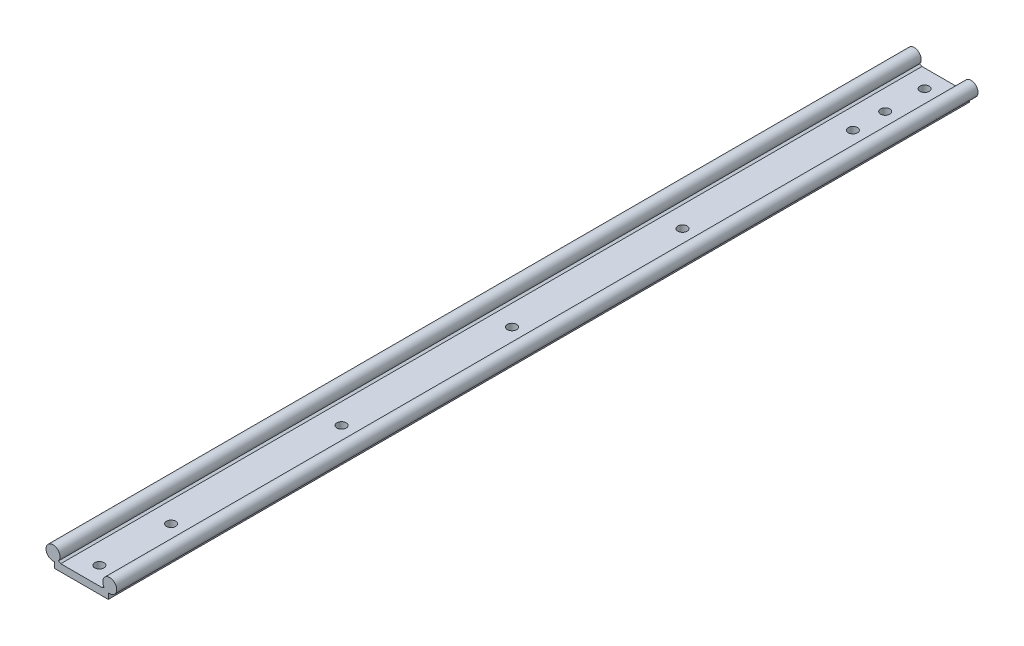
ISO-10303-21;
HEADER;
FILE_DESCRIPTION(('STEP AP214'),'2;1');
FILE_NAME('part.step','',(''),(''),'','','');
FILE_SCHEMA(('AUTOMOTIVE_DESIGN { 1 0 10303 214 1 1 1 1 }'));
ENDSEC;
DATA;
#1=APPLICATION_CONTEXT('core data for automotive mechanical design processes');
#2=APPLICATION_PROTOCOL_DEFINITION('international standard','automotive_design',2000,#1);
#3=PRODUCT_CONTEXT('',#1,'mechanical');
#4=PRODUCT('Part','Part','',(#3));
#5=PRODUCT_RELATED_PRODUCT_CATEGORY('part','',(#4));
#6=PRODUCT_DEFINITION_FORMATION('','',#4);
#7=PRODUCT_DEFINITION_CONTEXT('part definition',#1,'design');
#8=PRODUCT_DEFINITION('design','',#6,#7);
#9=PRODUCT_DEFINITION_SHAPE('','',#8);
#10=(LENGTH_UNIT() NAMED_UNIT(*) SI_UNIT(.MILLI.,.METRE.));
#11=(NAMED_UNIT(*) PLANE_ANGLE_UNIT() SI_UNIT($,.RADIAN.));
#12=(NAMED_UNIT(*) SI_UNIT($,.STERADIAN.) SOLID_ANGLE_UNIT());
#13=UNCERTAINTY_MEASURE_WITH_UNIT(LENGTH_MEASURE(1.E-05),#10,'distance_accuracy_value','');
#14=(GEOMETRIC_REPRESENTATION_CONTEXT(3) GLOBAL_UNCERTAINTY_ASSIGNED_CONTEXT((#13)) GLOBAL_UNIT_ASSIGNED_CONTEXT((#10,
#11,#12)) REPRESENTATION_CONTEXT('',''));
#15=CARTESIAN_POINT('',(0.,0.,0.));
#16=DIRECTION('',(0.,0.,1.));
#17=DIRECTION('',(1.,0.,0.));
#18=AXIS2_PLACEMENT_3D('',#15,#16,#17);
#19=CARTESIAN_POINT('',(20.0914,9.017,304.8));
#20=DIRECTION('',(0.,0.,-1.));
#21=DIRECTION('',(-1.,0.,0.));
#22=AXIS2_PLACEMENT_3D('',#19,#20,#21);
#23=CYLINDRICAL_SURFACE('',#22,4.953);
#24=CARTESIAN_POINT('',(20.0914,9.017,-304.8));
#25=DIRECTION('',(0.,0.,1.));
#26=DIRECTION('',(1.,0.,0.));
#27=AXIS2_PLACEMENT_3D('',#24,#25,#26);
#28=CIRCLE('',#27,4.953);
#29=CARTESIAN_POINT('',(19.05,4.17471799251633,-304.8));
#30=VERTEX_POINT('',#29);
#31=CARTESIAN_POINT('',(16.1741418537718,5.98594447167185,-304.8));
#32=VERTEX_POINT('',#31);
#33=EDGE_CURVE('E131',#30,#32,#28,.T.);
#34=ORIENTED_EDGE('',*,*,#33,.T.);
#35=DIRECTION('',(0.,0.,-1.));
#36=VECTOR('',#35,1.);
#37=CARTESIAN_POINT('',(16.1741418537718,5.98594447167185,304.8));
#38=LINE('',#37,#36);
#39=CARTESIAN_POINT('',(16.1741418537718,5.98594447167185,304.8));
#40=VERTEX_POINT('',#39);
#41=EDGE_CURVE('E11',#40,#32,#38,.T.);
#42=ORIENTED_EDGE('',*,*,#41,.F.);
#43=CARTESIAN_POINT('',(20.0914,9.017,304.8));
#44=DIRECTION('',(0.,0.,1.));
#45=DIRECTION('',(1.,0.,0.));
#46=AXIS2_PLACEMENT_3D('',#43,#44,#45);
#47=CIRCLE('',#46,4.953);
#48=CARTESIAN_POINT('',(19.05,4.17471799251633,304.8));
#49=VERTEX_POINT('',#48);
#50=EDGE_CURVE('E146',#49,#40,#47,.T.);
#51=ORIENTED_EDGE('',*,*,#50,.F.);
#52=DIRECTION('',(0.,0.,-1.));
#53=VECTOR('',#52,1.);
#54=CARTESIAN_POINT('',(19.05,4.17471799251633,304.8));
#55=LINE('',#54,#53);
#56=EDGE_CURVE('E127',#49,#30,#55,.T.);
#57=ORIENTED_EDGE('',*,*,#56,.T.);
#58=EDGE_LOOP('',(#34,#42,#51,#57));
#59=FACE_BOUND('',#58,.T.);
#60=ADVANCED_FACE('F33',(#59),#23,.T.);
#61=CARTESIAN_POINT('',(14.605,5.08,304.8));
#62=DIRECTION('',(0.500000000000001,-0.866025403784438,0.));
#63=DIRECTION('',(0.866025403784438,0.500000000000001,0.));
#64=AXIS2_PLACEMENT_3D('',#61,#62,#63);
#65=PLANE('',#64);
#66=DIRECTION('',(-0.866025403784438,-0.500000000000001,0.));
#67=VECTOR('',#66,1.);
#68=CARTESIAN_POINT('',(14.605,5.08,-304.8));
#69=LINE('',#68,#67);
#70=CARTESIAN_POINT('',(14.605,5.08,-304.8));
#71=VERTEX_POINT('',#70);
#72=EDGE_CURVE('E134',#32,#71,#69,.T.);
#73=ORIENTED_EDGE('',*,*,#72,.T.);
#74=DIRECTION('',(0.,0.,-1.));
#75=VECTOR('',#74,1.);
#76=CARTESIAN_POINT('',(14.605,5.08,304.8));
#77=LINE('',#76,#75);
#78=CARTESIAN_POINT('',(14.605,5.08,304.8));
#79=VERTEX_POINT('',#78);
#80=EDGE_CURVE('E42',#79,#71,#77,.T.);
#81=ORIENTED_EDGE('',*,*,#80,.F.);
#82=DIRECTION('',(-0.866025403784438,-0.500000000000001,0.));
#83=VECTOR('',#82,1.);
#84=CARTESIAN_POINT('',(14.605,5.08,304.8));
#85=LINE('',#84,#83);
#86=EDGE_CURVE('E94',#40,#79,#85,.T.);
#87=ORIENTED_EDGE('',*,*,#86,.F.);
#88=ORIENTED_EDGE('',*,*,#41,.T.);
#89=EDGE_LOOP('',(#73,#81,#87,#88));
#90=FACE_BOUND('',#89,.T.);
#91=ADVANCED_FACE('F239',(#90),#65,.F.);
#92=CARTESIAN_POINT('',(-14.605,5.08,304.8));
#93=DIRECTION('',(0.,-1.,0.));
#94=DIRECTION('',(0.,0.,-1.));
#95=AXIS2_PLACEMENT_3D('',#92,#93,#94);
#96=PLANE('',#95);
#97=CARTESIAN_POINT('',(0.,5.08,-264.16));
#98=DIRECTION('',(0.,1.,0.));
#99=DIRECTION('',(0.,0.,1.));
#100=AXIS2_PLACEMENT_3D('',#97,#98,#99);
#101=CIRCLE('',#100,3.27659999999999);
#102=CARTESIAN_POINT('',(0.,5.08,-260.8834));
#103=VERTEX_POINT('',#102);
#104=EDGE_CURVE('E188',#103,#103,#101,.T.);
#105=ORIENTED_EDGE('',*,*,#104,.F.);
#106=EDGE_LOOP('',(#105));
#107=FACE_BOUND('',#106,.T.);
#108=CARTESIAN_POINT('',(0.,5.08,-292.1));
#109=DIRECTION('',(0.,1.,0.));
#110=DIRECTION('',(0.,0.,1.));
#111=AXIS2_PLACEMENT_3D('',#108,#109,#110);
#112=CIRCLE('',#111,3.2766);
#113=CARTESIAN_POINT('',(0.,5.08,-288.8234));
#114=VERTEX_POINT('',#113);
#115=EDGE_CURVE('E177',#114,#114,#112,.T.);
#116=ORIENTED_EDGE('',*,*,#115,.F.);
#117=EDGE_LOOP('',(#116));
#118=FACE_BOUND('',#117,.T.);
#119=CARTESIAN_POINT('',(0.,5.08,241.3));
#120=DIRECTION('',(0.,1.,0.));
#121=DIRECTION('',(0.,0.,1.));
#122=AXIS2_PLACEMENT_3D('',#119,#120,#121);
#123=CIRCLE('',#122,3.2766);
#124=CARTESIAN_POINT('',(0.,5.08,244.5766));
#125=VERTEX_POINT('',#124);
#126=EDGE_CURVE('E162',#125,#125,#123,.T.);
#127=ORIENTED_EDGE('',*,*,#126,.F.);
#128=EDGE_LOOP('',(#127));
#129=FACE_BOUND('',#128,.T.);
#130=CARTESIAN_POINT('',(-4.21247223531424E-13,5.08,120.65));
#131=DIRECTION('',(0.,1.,0.));
#132=DIRECTION('',(0.,0.,1.));
#133=AXIS2_PLACEMENT_3D('',#130,#131,#132);
#134=CIRCLE('',#133,3.2766);
#135=CARTESIAN_POINT('',(-4.21247223531424E-13,5.08,123.9266));
#136=VERTEX_POINT('',#135);
#137=EDGE_CURVE('E193',#136,#136,#134,.T.);
#138=ORIENTED_EDGE('',*,*,#137,.F.);
#139=EDGE_LOOP('',(#138));
#140=FACE_BOUND('',#139,.T.);
#141=CARTESIAN_POINT('',(-8.42494447062848E-13,5.08,0.));
#142=DIRECTION('',(0.,1.,0.));
#143=DIRECTION('',(0.,0.,1.));
#144=AXIS2_PLACEMENT_3D('',#141,#142,#143);
#145=CIRCLE('',#144,3.2766);
#146=CARTESIAN_POINT('',(-8.42494447062848E-13,5.08,3.27660000000003));
#147=VERTEX_POINT('',#146);
#148=EDGE_CURVE('E196',#147,#147,#145,.T.);
#149=ORIENTED_EDGE('',*,*,#148,.F.);
#150=EDGE_LOOP('',(#149));
#151=FACE_BOUND('',#150,.T.);
#152=CARTESIAN_POINT('',(-1.26374167059427E-12,5.08,-120.65));
#153=DIRECTION('',(0.,1.,0.));
#154=DIRECTION('',(0.,0.,1.));
#155=AXIS2_PLACEMENT_3D('',#152,#153,#154);
#156=CIRCLE('',#155,3.2766);
#157=CARTESIAN_POINT('',(-1.26374167059427E-12,5.08,-117.3734));
#158=VERTEX_POINT('',#157);
#159=EDGE_CURVE('E181',#158,#158,#156,.T.);
#160=ORIENTED_EDGE('',*,*,#159,.F.);
#161=EDGE_LOOP('',(#160));
#162=FACE_BOUND('',#161,.T.);
#163=CARTESIAN_POINT('',(-1.6849888941257E-12,5.08,-241.3));
#164=DIRECTION('',(0.,1.,0.));
#165=DIRECTION('',(0.,0.,1.));
#166=AXIS2_PLACEMENT_3D('',#163,#164,#165);
#167=CIRCLE('',#166,3.2766);
#168=CARTESIAN_POINT('',(-1.6849888941257E-12,5.08,-238.0234));
#169=VERTEX_POINT('',#168);
#170=EDGE_CURVE('E176',#169,#169,#167,.T.);
#171=ORIENTED_EDGE('',*,*,#170,.F.);
#172=EDGE_LOOP('',(#171));
#173=FACE_BOUND('',#172,.T.);
#174=CARTESIAN_POINT('',(0.,5.08,292.1));
#175=DIRECTION('',(0.,1.,0.));
#176=DIRECTION('',(0.,0.,1.));
#177=AXIS2_PLACEMENT_3D('',#174,#175,#176);
#178=CIRCLE('',#177,3.2766);
#179=CARTESIAN_POINT('',(0.,5.08,295.3766));
#180=VERTEX_POINT('',#179);
#181=EDGE_CURVE('E173',#180,#180,#178,.T.);
#182=ORIENTED_EDGE('',*,*,#181,.F.);
#183=EDGE_LOOP('',(#182));
#184=FACE_BOUND('',#183,.T.);
#185=DIRECTION('',(-1.,0.,0.));
#186=VECTOR('',#185,1.);
#187=CARTESIAN_POINT('',(-14.605,5.08,-304.8));
#188=LINE('',#187,#186);
#189=CARTESIAN_POINT('',(-14.605,5.08,-304.8));
#190=VERTEX_POINT('',#189);
#191=EDGE_CURVE('E137',#71,#190,#188,.T.);
#192=ORIENTED_EDGE('',*,*,#191,.T.);
#193=DIRECTION('',(0.,0.,-1.));
#194=VECTOR('',#193,1.);
#195=CARTESIAN_POINT('',(-14.605,5.08,304.8));
#196=LINE('',#195,#194);
#197=CARTESIAN_POINT('',(-14.605,5.08,304.8));
#198=VERTEX_POINT('',#197);
#199=EDGE_CURVE('E153',#198,#190,#196,.T.);
#200=ORIENTED_EDGE('',*,*,#199,.F.);
#201=DIRECTION('',(-1.,0.,0.));
#202=VECTOR('',#201,1.);
#203=CARTESIAN_POINT('',(-14.605,5.08,304.8));
#204=LINE('',#203,#202);
#205=EDGE_CURVE('E207',#79,#198,#204,.T.);
#206=ORIENTED_EDGE('',*,*,#205,.F.);
#207=ORIENTED_EDGE('',*,*,#80,.T.);
#208=EDGE_LOOP('',(#192,#200,#206,#207));
#209=FACE_BOUND('',#208,.T.);
#210=ADVANCED_FACE('F243',(#107,#118,#129,#140,#151,#162,#173,#184,#209),#96,.F.);
#211=CARTESIAN_POINT('',(-14.605,5.08,304.8));
#212=DIRECTION('',(-0.499999999999995,-0.866025403784442,0.));
#213=DIRECTION('',(0.866025403784442,-0.499999999999995,0.));
#214=AXIS2_PLACEMENT_3D('',#211,#212,#213);
#215=PLANE('',#214);
#216=DIRECTION('',(-0.866025403784441,0.499999999999995,0.));
#217=VECTOR('',#216,1.);
#218=CARTESIAN_POINT('',(-14.605,5.08,-304.8));
#219=LINE('',#218,#217);
#220=CARTESIAN_POINT('',(-16.1741418537718,5.98594447167184,-304.8));
#221=VERTEX_POINT('',#220);
#222=EDGE_CURVE('E139',#190,#221,#219,.T.);
#223=ORIENTED_EDGE('',*,*,#222,.T.);
#224=DIRECTION('',(0.,0.,-1.));
#225=VECTOR('',#224,1.);
#226=CARTESIAN_POINT('',(-16.1741418537718,5.98594447167184,304.8));
#227=LINE('',#226,#225);
#228=CARTESIAN_POINT('',(-16.1741418537718,5.98594447167184,304.8));
#229=VERTEX_POINT('',#228);
#230=EDGE_CURVE('E150',#229,#221,#227,.T.);
#231=ORIENTED_EDGE('',*,*,#230,.F.);
#232=DIRECTION('',(-0.866025403784441,0.499999999999995,0.));
#233=VECTOR('',#232,1.);
#234=CARTESIAN_POINT('',(-14.605,5.08,304.8));
#235=LINE('',#234,#233);
#236=EDGE_CURVE('E209',#198,#229,#235,.T.);
#237=ORIENTED_EDGE('',*,*,#236,.F.);
#238=ORIENTED_EDGE('',*,*,#199,.T.);
#239=EDGE_LOOP('',(#223,#231,#237,#238));
#240=FACE_BOUND('',#239,.T.);
#241=ADVANCED_FACE('F215',(#240),#215,.F.);
#242=CARTESIAN_POINT('',(-20.0914,9.017,304.8));
#243=DIRECTION('',(0.,0.,-1.));
#244=DIRECTION('',(-1.,0.,0.));
#245=AXIS2_PLACEMENT_3D('',#242,#243,#244);
#246=CYLINDRICAL_SURFACE('',#245,4.953);
#247=CARTESIAN_POINT('',(-20.0914,9.017,-304.8));
#248=DIRECTION('',(0.,0.,1.));
#249=DIRECTION('',(1.,0.,0.));
#250=AXIS2_PLACEMENT_3D('',#247,#248,#249);
#251=CIRCLE('',#250,4.953);
#252=CARTESIAN_POINT('',(-19.05,4.17471799251634,-304.8));
#253=VERTEX_POINT('',#252);
#254=EDGE_CURVE('E141',#221,#253,#251,.T.);
#255=ORIENTED_EDGE('',*,*,#254,.T.);
#256=DIRECTION('',(0.,0.,-1.));
#257=VECTOR('',#256,1.);
#258=CARTESIAN_POINT('',(-19.05,4.17471799251634,304.8));
#259=LINE('',#258,#257);
#260=CARTESIAN_POINT('',(-19.05,4.17471799251634,304.8));
#261=VERTEX_POINT('',#260);
#262=EDGE_CURVE('E122',#261,#253,#259,.T.);
#263=ORIENTED_EDGE('',*,*,#262,.F.);
#264=CARTESIAN_POINT('',(-20.0914,9.017,304.8));
#265=DIRECTION('',(0.,0.,1.));
#266=DIRECTION('',(1.,0.,0.));
#267=AXIS2_PLACEMENT_3D('',#264,#265,#266);
#268=CIRCLE('',#267,4.953);
#269=EDGE_CURVE('E113',#229,#261,#268,.T.);
#270=ORIENTED_EDGE('',*,*,#269,.F.);
#271=ORIENTED_EDGE('',*,*,#230,.T.);
#272=EDGE_LOOP('',(#255,#263,#270,#271));
#273=FACE_BOUND('',#272,.T.);
#274=ADVANCED_FACE('F219',(#273),#246,.T.);
#275=CARTESIAN_POINT('',(-19.05,4.17471799251634,304.8));
#276=DIRECTION('',(1.,0.,0.));
#277=DIRECTION('',(0.,0.,-1.));
#278=AXIS2_PLACEMENT_3D('',#275,#276,#277);
#279=PLANE('',#278);
#280=DIRECTION('',(0.,-1.,0.));
#281=VECTOR('',#280,1.);
#282=CARTESIAN_POINT('',(-19.05,4.17471799251634,-304.8));
#283=LINE('',#282,#281);
#284=CARTESIAN_POINT('',(-19.05,0.,-304.8));
#285=VERTEX_POINT('',#284);
#286=EDGE_CURVE('E121',#253,#285,#283,.T.);
#287=ORIENTED_EDGE('',*,*,#286,.T.);
#288=DIRECTION('',(0.,0.,-1.));
#289=VECTOR('',#288,1.);
#290=CARTESIAN_POINT('',(-19.05,0.,304.8));
#291=LINE('',#290,#289);
#292=CARTESIAN_POINT('',(-19.05,0.,304.8));
#293=VERTEX_POINT('',#292);
#294=EDGE_CURVE('E118',#293,#285,#291,.T.);
#295=ORIENTED_EDGE('',*,*,#294,.F.);
#296=DIRECTION('',(0.,-1.,0.));
#297=VECTOR('',#296,1.);
#298=CARTESIAN_POINT('',(-19.05,4.17471799251634,304.8));
#299=LINE('',#298,#297);
#300=EDGE_CURVE('E107',#261,#293,#299,.T.);
#301=ORIENTED_EDGE('',*,*,#300,.F.);
#302=ORIENTED_EDGE('',*,*,#262,.T.);
#303=EDGE_LOOP('',(#287,#295,#301,#302));
#304=FACE_BOUND('',#303,.T.);
#305=ADVANCED_FACE('F119',(#304),#279,.F.);
#306=CARTESIAN_POINT('',(-19.05,0.,304.8));
#307=DIRECTION('',(0.,1.,0.));
#308=DIRECTION('',(-1.,0.,0.));
#309=AXIS2_PLACEMENT_3D('',#306,#307,#308);
#310=PLANE('',#309);
#311=CARTESIAN_POINT('',(0.,0.,-264.16));
#312=DIRECTION('',(0.,1.,0.));
#313=DIRECTION('',(-1.,0.,0.));
#314=AXIS2_PLACEMENT_3D('',#311,#312,#313);
#315=CIRCLE('',#314,3.27659999999999);
#316=CARTESIAN_POINT('',(-3.27659999999999,0.,-264.16));
#317=VERTEX_POINT('',#316);
#318=EDGE_CURVE('E36',#317,#317,#315,.T.);
#319=ORIENTED_EDGE('',*,*,#318,.T.);
#320=EDGE_LOOP('',(#319));
#321=FACE_BOUND('',#320,.T.);
#322=CARTESIAN_POINT('',(0.,0.,-292.1));
#323=DIRECTION('',(0.,1.,0.));
#324=DIRECTION('',(-1.,0.,0.));
#325=AXIS2_PLACEMENT_3D('',#322,#323,#324);
#326=CIRCLE('',#325,3.2766);
#327=CARTESIAN_POINT('',(-3.2766,0.,-292.1));
#328=VERTEX_POINT('',#327);
#329=EDGE_CURVE('E174',#328,#328,#326,.T.);
#330=ORIENTED_EDGE('',*,*,#329,.T.);
#331=EDGE_LOOP('',(#330));
#332=FACE_BOUND('',#331,.T.);
#333=CARTESIAN_POINT('',(0.,0.,241.3));
#334=DIRECTION('',(0.,1.,0.));
#335=DIRECTION('',(-1.,0.,0.));
#336=AXIS2_PLACEMENT_3D('',#333,#334,#335);
#337=CIRCLE('',#336,3.2766);
#338=CARTESIAN_POINT('',(-3.2766,0.,241.3));
#339=VERTEX_POINT('',#338);
#340=EDGE_CURVE('E171',#339,#339,#337,.T.);
#341=ORIENTED_EDGE('',*,*,#340,.T.);
#342=EDGE_LOOP('',(#341));
#343=FACE_BOUND('',#342,.T.);
#344=CARTESIAN_POINT('',(-4.21247223531424E-13,0.,120.65));
#345=DIRECTION('',(0.,1.,0.));
#346=DIRECTION('',(-1.,0.,0.));
#347=AXIS2_PLACEMENT_3D('',#344,#345,#346);
#348=CIRCLE('',#347,3.2766);
#349=CARTESIAN_POINT('',(-3.27660000000042,0.,120.65));
#350=VERTEX_POINT('',#349);
#351=EDGE_CURVE('E168',#350,#350,#348,.T.);
#352=ORIENTED_EDGE('',*,*,#351,.T.);
#353=EDGE_LOOP('',(#352));
#354=FACE_BOUND('',#353,.T.);
#355=CARTESIAN_POINT('',(-8.42494447062848E-13,0.,0.));
#356=DIRECTION('',(0.,1.,0.));
#357=DIRECTION('',(-1.,0.,0.));
#358=AXIS2_PLACEMENT_3D('',#355,#356,#357);
#359=CIRCLE('',#358,3.2766);
#360=CARTESIAN_POINT('',(-3.27660000000084,0.,0.));
#361=VERTEX_POINT('',#360);
#362=EDGE_CURVE('E165',#361,#361,#359,.T.);
#363=ORIENTED_EDGE('',*,*,#362,.T.);
#364=EDGE_LOOP('',(#363));
#365=FACE_BOUND('',#364,.T.);
#366=CARTESIAN_POINT('',(-1.26374167059427E-12,0.,-120.65));
#367=DIRECTION('',(0.,1.,0.));
#368=DIRECTION('',(-1.,0.,0.));
#369=AXIS2_PLACEMENT_3D('',#366,#367,#368);
#370=CIRCLE('',#369,3.2766);
#371=CARTESIAN_POINT('',(-3.27660000000126,0.,-120.65));
#372=VERTEX_POINT('',#371);
#373=EDGE_CURVE('E161',#372,#372,#370,.T.);
#374=ORIENTED_EDGE('',*,*,#373,.T.);
#375=EDGE_LOOP('',(#374));
#376=FACE_BOUND('',#375,.T.);
#377=CARTESIAN_POINT('',(-1.6849888941257E-12,0.,-241.3));
#378=DIRECTION('',(0.,1.,0.));
#379=DIRECTION('',(-1.,0.,0.));
#380=AXIS2_PLACEMENT_3D('',#377,#378,#379);
#381=CIRCLE('',#380,3.2766);
#382=CARTESIAN_POINT('',(-3.27660000000168,0.,-241.3));
#383=VERTEX_POINT('',#382);
#384=EDGE_CURVE('E158',#383,#383,#381,.T.);
#385=ORIENTED_EDGE('',*,*,#384,.T.);
#386=EDGE_LOOP('',(#385));
#387=FACE_BOUND('',#386,.T.);
#388=CARTESIAN_POINT('',(0.,0.,292.1));
#389=DIRECTION('',(0.,1.,0.));
#390=DIRECTION('',(0.,0.,1.));
#391=AXIS2_PLACEMENT_3D('',#388,#389,#390);
#392=CIRCLE('',#391,3.2766);
#393=CARTESIAN_POINT('',(0.,0.,295.3766));
#394=VERTEX_POINT('',#393);
#395=EDGE_CURVE('E135',#394,#394,#392,.T.);
#396=ORIENTED_EDGE('',*,*,#395,.T.);
#397=EDGE_LOOP('',(#396));
#398=FACE_BOUND('',#397,.T.);
#399=DIRECTION('',(1.,0.,0.));
#400=VECTOR('',#399,1.);
#401=CARTESIAN_POINT('',(-19.05,0.,-304.8));
#402=LINE('',#401,#400);
#403=CARTESIAN_POINT('',(19.05,0.,-304.8));
#404=VERTEX_POINT('',#403);
#405=EDGE_CURVE('E80',#285,#404,#402,.T.);
#406=ORIENTED_EDGE('',*,*,#405,.T.);
#407=DIRECTION('',(0.,0.,-1.));
#408=VECTOR('',#407,1.);
#409=CARTESIAN_POINT('',(19.05,0.,304.8));
#410=LINE('',#409,#408);
#411=CARTESIAN_POINT('',(19.05,0.,304.8));
#412=VERTEX_POINT('',#411);
#413=EDGE_CURVE('E123',#412,#404,#410,.T.);
#414=ORIENTED_EDGE('',*,*,#413,.F.);
#415=DIRECTION('',(1.,0.,0.));
#416=VECTOR('',#415,1.);
#417=CARTESIAN_POINT('',(-19.05,0.,304.8));
#418=LINE('',#417,#416);
#419=EDGE_CURVE('E111',#293,#412,#418,.T.);
#420=ORIENTED_EDGE('',*,*,#419,.F.);
#421=ORIENTED_EDGE('',*,*,#294,.T.);
#422=EDGE_LOOP('',(#406,#414,#420,#421));
#423=FACE_BOUND('',#422,.T.);
#424=ADVANCED_FACE('F125',(#321,#332,#343,#354,#365,#376,#387,#398,#423),#310,.F.);
#425=CARTESIAN_POINT('',(19.05,4.17471799251633,304.8));
#426=DIRECTION('',(-1.,0.,0.));
#427=DIRECTION('',(0.,0.,1.));
#428=AXIS2_PLACEMENT_3D('',#425,#426,#427);
#429=PLANE('',#428);
#430=DIRECTION('',(0.,1.,0.));
#431=VECTOR('',#430,1.);
#432=CARTESIAN_POINT('',(19.05,4.17471799251633,-304.8));
#433=LINE('',#432,#431);
#434=EDGE_CURVE('E86',#404,#30,#433,.T.);
#435=ORIENTED_EDGE('',*,*,#434,.T.);
#436=ORIENTED_EDGE('',*,*,#56,.F.);
#437=DIRECTION('',(0.,1.,0.));
#438=VECTOR('',#437,1.);
#439=CARTESIAN_POINT('',(19.05,4.17471799251633,304.8));
#440=LINE('',#439,#438);
#441=EDGE_CURVE('E51',#412,#49,#440,.T.);
#442=ORIENTED_EDGE('',*,*,#441,.F.);
#443=ORIENTED_EDGE('',*,*,#413,.T.);
#444=EDGE_LOOP('',(#435,#436,#442,#443));
#445=FACE_BOUND('',#444,.T.);
#446=ADVANCED_FACE('F227',(#445),#429,.F.);
#447=CARTESIAN_POINT('',(20.0914,9.017,304.8));
#448=DIRECTION('',(0.,0.,1.));
#449=DIRECTION('',(1.,0.,0.));
#450=AXIS2_PLACEMENT_3D('',#447,#448,#449);
#451=PLANE('',#450);
#452=ORIENTED_EDGE('',*,*,#50,.T.);
#453=ORIENTED_EDGE('',*,*,#86,.T.);
#454=ORIENTED_EDGE('',*,*,#205,.T.);
#455=ORIENTED_EDGE('',*,*,#236,.T.);
#456=ORIENTED_EDGE('',*,*,#269,.T.);
#457=ORIENTED_EDGE('',*,*,#300,.T.);
#458=ORIENTED_EDGE('',*,*,#419,.T.);
#459=ORIENTED_EDGE('',*,*,#441,.T.);
#460=EDGE_LOOP('',(#452,#453,#454,#455,#456,#457,#458,#459));
#461=FACE_BOUND('',#460,.T.);
#462=ADVANCED_FACE('F109',(#461),#451,.T.);
#463=CARTESIAN_POINT('',(20.0914,9.017,-304.8));
#464=DIRECTION('',(0.,0.,1.));
#465=DIRECTION('',(1.,0.,0.));
#466=AXIS2_PLACEMENT_3D('',#463,#464,#465);
#467=PLANE('',#466);
#468=ORIENTED_EDGE('',*,*,#33,.F.);
#469=ORIENTED_EDGE('',*,*,#434,.F.);
#470=ORIENTED_EDGE('',*,*,#405,.F.);
#471=ORIENTED_EDGE('',*,*,#286,.F.);
#472=ORIENTED_EDGE('',*,*,#254,.F.);
#473=ORIENTED_EDGE('',*,*,#222,.F.);
#474=ORIENTED_EDGE('',*,*,#191,.F.);
#475=ORIENTED_EDGE('',*,*,#72,.F.);
#476=EDGE_LOOP('',(#468,#469,#470,#471,#472,#473,#474,#475));
#477=FACE_BOUND('',#476,.T.);
#478=ADVANCED_FACE('F222',(#477),#467,.F.);
#479=CARTESIAN_POINT('',(0.,0.,292.1));
#480=DIRECTION('',(0.,1.,0.));
#481=DIRECTION('',(0.,0.,1.));
#482=AXIS2_PLACEMENT_3D('',#479,#480,#481);
#483=CYLINDRICAL_SURFACE('',#482,3.2766);
#484=ORIENTED_EDGE('',*,*,#395,.F.);
#485=EDGE_LOOP('',(#484));
#486=FACE_BOUND('',#485,.T.);
#487=ORIENTED_EDGE('',*,*,#181,.T.);
#488=EDGE_LOOP('',(#487));
#489=FACE_BOUND('',#488,.T.);
#490=ADVANCED_FACE('F325',(#486,#489),#483,.F.);
#491=CARTESIAN_POINT('',(-1.6849888941257E-12,-20.32,-241.3));
#492=DIRECTION('',(0.,1.,0.));
#493=DIRECTION('',(0.,0.,1.));
#494=AXIS2_PLACEMENT_3D('',#491,#492,#493);
#495=CYLINDRICAL_SURFACE('',#494,3.2766);
#496=ORIENTED_EDGE('',*,*,#170,.T.);
#497=EDGE_LOOP('',(#496));
#498=FACE_BOUND('',#497,.T.);
#499=ORIENTED_EDGE('',*,*,#384,.F.);
#500=EDGE_LOOP('',(#499));
#501=FACE_BOUND('',#500,.T.);
#502=ADVANCED_FACE('F317',(#498,#501),#495,.F.);
#503=CARTESIAN_POINT('',(-1.26374167059427E-12,-20.32,-120.65));
#504=DIRECTION('',(0.,1.,0.));
#505=DIRECTION('',(0.,0.,1.));
#506=AXIS2_PLACEMENT_3D('',#503,#504,#505);
#507=CYLINDRICAL_SURFACE('',#506,3.2766);
#508=ORIENTED_EDGE('',*,*,#159,.T.);
#509=EDGE_LOOP('',(#508));
#510=FACE_BOUND('',#509,.T.);
#511=ORIENTED_EDGE('',*,*,#373,.F.);
#512=EDGE_LOOP('',(#511));
#513=FACE_BOUND('',#512,.T.);
#514=ADVANCED_FACE('F309',(#510,#513),#507,.F.);
#515=CARTESIAN_POINT('',(-8.42494447062848E-13,-20.32,0.));
#516=DIRECTION('',(0.,1.,0.));
#517=DIRECTION('',(0.,0.,1.));
#518=AXIS2_PLACEMENT_3D('',#515,#516,#517);
#519=CYLINDRICAL_SURFACE('',#518,3.2766);
#520=ORIENTED_EDGE('',*,*,#148,.T.);
#521=EDGE_LOOP('',(#520));
#522=FACE_BOUND('',#521,.T.);
#523=ORIENTED_EDGE('',*,*,#362,.F.);
#524=EDGE_LOOP('',(#523));
#525=FACE_BOUND('',#524,.T.);
#526=ADVANCED_FACE('F301',(#522,#525),#519,.F.);
#527=CARTESIAN_POINT('',(-4.21247223531424E-13,-20.32,120.65));
#528=DIRECTION('',(0.,1.,0.));
#529=DIRECTION('',(0.,0.,1.));
#530=AXIS2_PLACEMENT_3D('',#527,#528,#529);
#531=CYLINDRICAL_SURFACE('',#530,3.2766);
#532=ORIENTED_EDGE('',*,*,#137,.T.);
#533=EDGE_LOOP('',(#532));
#534=FACE_BOUND('',#533,.T.);
#535=ORIENTED_EDGE('',*,*,#351,.F.);
#536=EDGE_LOOP('',(#535));
#537=FACE_BOUND('',#536,.T.);
#538=ADVANCED_FACE('F293',(#534,#537),#531,.F.);
#539=CARTESIAN_POINT('',(0.,-20.32,241.3));
#540=DIRECTION('',(0.,1.,0.));
#541=DIRECTION('',(0.,0.,1.));
#542=AXIS2_PLACEMENT_3D('',#539,#540,#541);
#543=CYLINDRICAL_SURFACE('',#542,3.2766);
#544=ORIENTED_EDGE('',*,*,#126,.T.);
#545=EDGE_LOOP('',(#544));
#546=FACE_BOUND('',#545,.T.);
#547=ORIENTED_EDGE('',*,*,#340,.F.);
#548=EDGE_LOOP('',(#547));
#549=FACE_BOUND('',#548,.T.);
#550=ADVANCED_FACE('F287',(#546,#549),#543,.F.);
#551=CARTESIAN_POINT('',(0.,-20.32,-292.1));
#552=DIRECTION('',(0.,1.,0.));
#553=DIRECTION('',(0.,0.,1.));
#554=AXIS2_PLACEMENT_3D('',#551,#552,#553);
#555=CYLINDRICAL_SURFACE('',#554,3.2766);
#556=ORIENTED_EDGE('',*,*,#115,.T.);
#557=EDGE_LOOP('',(#556));
#558=FACE_BOUND('',#557,.T.);
#559=ORIENTED_EDGE('',*,*,#329,.F.);
#560=EDGE_LOOP('',(#559));
#561=FACE_BOUND('',#560,.T.);
#562=ADVANCED_FACE('F277',(#558,#561),#555,.F.);
#563=CARTESIAN_POINT('',(0.,-20.32,-264.16));
#564=DIRECTION('',(0.,1.,0.));
#565=DIRECTION('',(0.,0.,1.));
#566=AXIS2_PLACEMENT_3D('',#563,#564,#565);
#567=CYLINDRICAL_SURFACE('',#566,3.27659999999999);
#568=ORIENTED_EDGE('',*,*,#104,.T.);
#569=EDGE_LOOP('',(#568));
#570=FACE_BOUND('',#569,.T.);
#571=ORIENTED_EDGE('',*,*,#318,.F.);
#572=EDGE_LOOP('',(#571));
#573=FACE_BOUND('',#572,.T.);
#574=ADVANCED_FACE('F273',(#570,#573),#567,.F.);
#575=CLOSED_SHELL('',(#60,#91,#210,#241,#274,#305,#424,#446,#462,#478,#490,#502,#514,#526,#538,
#550,#562,#574));
#576=MANIFOLD_SOLID_BREP('B2',#575);
#577=ADVANCED_BREP_SHAPE_REPRESENTATION('',(#18,#576),#14);
#578=SHAPE_DEFINITION_REPRESENTATION(#9,#577);
ENDSEC;
END-ISO-10303-21;
